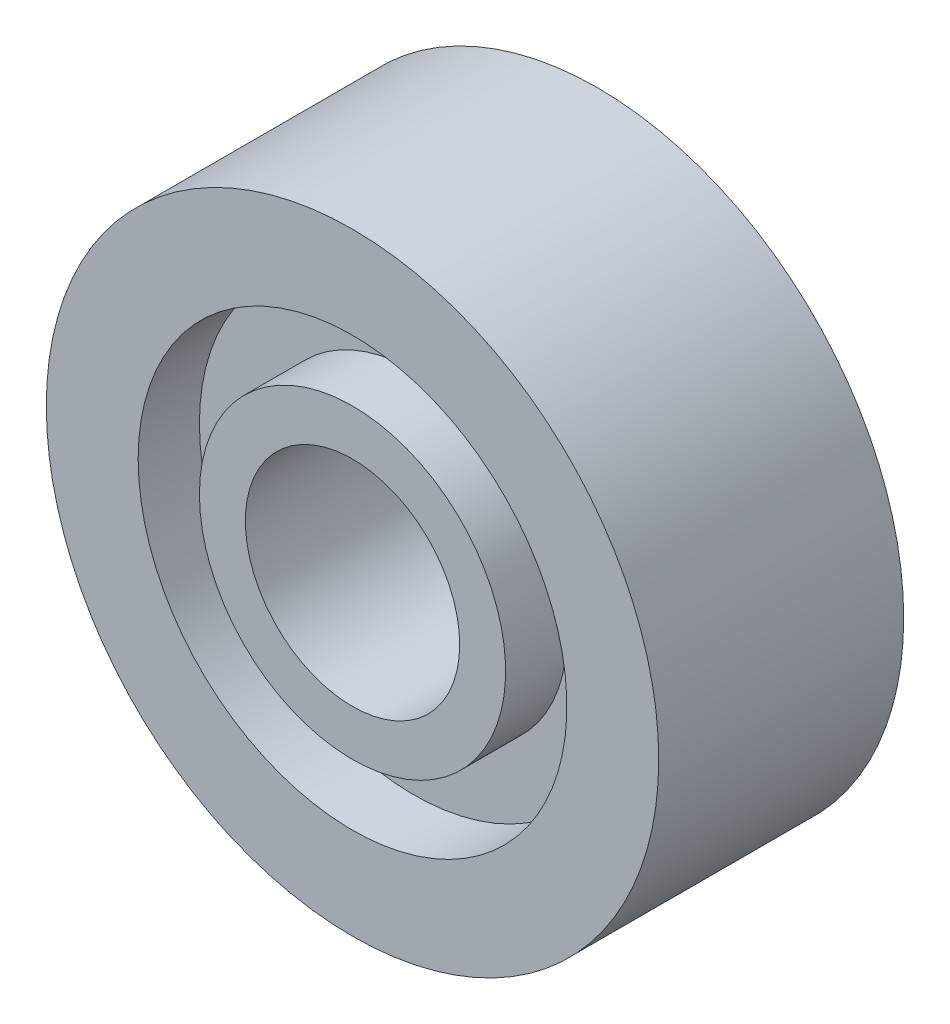
ISO-10303-21;
HEADER;
FILE_DESCRIPTION(('STEP AP214'),'2;1');
FILE_NAME('part.step','',(''),(''),'','','');
FILE_SCHEMA(('AUTOMOTIVE_DESIGN { 1 0 10303 214 1 1 1 1 }'));
ENDSEC;
DATA;
#1=APPLICATION_CONTEXT('core data for automotive mechanical design processes');
#2=APPLICATION_PROTOCOL_DEFINITION('international standard','automotive_design',2000,#1);
#3=PRODUCT_CONTEXT('',#1,'mechanical');
#4=PRODUCT('Part','Part','',(#3));
#5=PRODUCT_RELATED_PRODUCT_CATEGORY('part','',(#4));
#6=PRODUCT_DEFINITION_FORMATION('','',#4);
#7=PRODUCT_DEFINITION_CONTEXT('part definition',#1,'design');
#8=PRODUCT_DEFINITION('design','',#6,#7);
#9=PRODUCT_DEFINITION_SHAPE('','',#8);
#10=(LENGTH_UNIT() NAMED_UNIT(*) SI_UNIT(.MILLI.,.METRE.));
#11=(NAMED_UNIT(*) PLANE_ANGLE_UNIT() SI_UNIT($,.RADIAN.));
#12=(NAMED_UNIT(*) SI_UNIT($,.STERADIAN.) SOLID_ANGLE_UNIT());
#13=UNCERTAINTY_MEASURE_WITH_UNIT(LENGTH_MEASURE(1.E-05),#10,'distance_accuracy_value','');
#14=(GEOMETRIC_REPRESENTATION_CONTEXT(3) GLOBAL_UNCERTAINTY_ASSIGNED_CONTEXT((#13)) GLOBAL_UNIT_ASSIGNED_CONTEXT((#10,
#11,#12)) REPRESENTATION_CONTEXT('',''));
#15=CARTESIAN_POINT('',(0.,0.,0.));
#16=DIRECTION('',(0.,0.,1.));
#17=DIRECTION('',(1.,0.,0.));
#18=AXIS2_PLACEMENT_3D('',#15,#16,#17);
#19=CARTESIAN_POINT('',(0.,0.,4.));
#20=DIRECTION('',(0.,0.,1.));
#21=DIRECTION('',(1.,0.,0.));
#22=AXIS2_PLACEMENT_3D('',#19,#20,#21);
#23=PLANE('',#22);
#24=CARTESIAN_POINT('',(0.,0.,4.));
#25=DIRECTION('',(0.,0.,1.));
#26=DIRECTION('',(1.,0.,0.));
#27=AXIS2_PLACEMENT_3D('',#24,#25,#26);
#28=CIRCLE('',#27,1.75);
#29=CARTESIAN_POINT('',(1.75,0.,4.));
#30=VERTEX_POINT('',#29);
#31=EDGE_CURVE('E43',#30,#30,#28,.T.);
#32=ORIENTED_EDGE('',*,*,#31,.F.);
#33=EDGE_LOOP('',(#32));
#34=FACE_BOUND('',#33,.T.);
#35=CARTESIAN_POINT('',(0.,0.,4.));
#36=DIRECTION('',(0.,0.,-1.));
#37=DIRECTION('',(-1.,0.,0.));
#38=AXIS2_PLACEMENT_3D('',#35,#36,#37);
#39=CIRCLE('',#38,2.5);
#40=CARTESIAN_POINT('',(-2.5,0.,4.));
#41=VERTEX_POINT('',#40);
#42=EDGE_CURVE('E69',#41,#41,#39,.T.);
#43=ORIENTED_EDGE('',*,*,#42,.F.);
#44=EDGE_LOOP('',(#43));
#45=FACE_BOUND('',#44,.T.);
#46=ADVANCED_FACE('F32',(#34,#45),#23,.T.);
#47=CARTESIAN_POINT('',(0.,0.,0.));
#48=DIRECTION('',(0.,0.,1.));
#49=DIRECTION('',(1.,0.,0.));
#50=AXIS2_PLACEMENT_3D('',#47,#48,#49);
#51=PLANE('',#50);
#52=CARTESIAN_POINT('',(0.,0.,0.));
#53=DIRECTION('',(0.,0.,1.));
#54=DIRECTION('',(1.,0.,0.));
#55=AXIS2_PLACEMENT_3D('',#52,#53,#54);
#56=CIRCLE('',#55,1.75);
#57=CARTESIAN_POINT('',(1.75,0.,0.));
#58=VERTEX_POINT('',#57);
#59=EDGE_CURVE('E45',#58,#58,#56,.T.);
#60=ORIENTED_EDGE('',*,*,#59,.T.);
#61=EDGE_LOOP('',(#60));
#62=FACE_BOUND('',#61,.T.);
#63=CARTESIAN_POINT('',(0.,0.,0.));
#64=DIRECTION('',(0.,0.,-1.));
#65=DIRECTION('',(-1.,0.,0.));
#66=AXIS2_PLACEMENT_3D('',#63,#64,#65);
#67=CIRCLE('',#66,2.5);
#68=CARTESIAN_POINT('',(-2.5,0.,0.));
#69=VERTEX_POINT('',#68);
#70=EDGE_CURVE('E57',#69,#69,#67,.T.);
#71=ORIENTED_EDGE('',*,*,#70,.T.);
#72=EDGE_LOOP('',(#71));
#73=FACE_BOUND('',#72,.T.);
#74=ADVANCED_FACE('F85',(#62,#73),#51,.F.);
#75=CARTESIAN_POINT('',(0.,0.,4.));
#76=DIRECTION('',(0.,0.,-1.));
#77=DIRECTION('',(-1.,0.,0.));
#78=AXIS2_PLACEMENT_3D('',#75,#76,#77);
#79=CIRCLE('',#78,3.5);
#80=CARTESIAN_POINT('',(-3.5,0.,4.));
#81=VERTEX_POINT('',#80);
#82=EDGE_CURVE('E63',#81,#81,#79,.T.);
#83=ORIENTED_EDGE('',*,*,#82,.T.);
#84=EDGE_LOOP('',(#83));
#85=FACE_BOUND('',#84,.T.);
#86=CARTESIAN_POINT('',(0.,0.,4.));
#87=DIRECTION('',(0.,0.,1.));
#88=DIRECTION('',(1.,0.,0.));
#89=AXIS2_PLACEMENT_3D('',#86,#87,#88);
#90=CIRCLE('',#89,5.);
#91=CARTESIAN_POINT('',(5.,0.,4.));
#92=VERTEX_POINT('',#91);
#93=EDGE_CURVE('E10',#92,#92,#90,.T.);
#94=ORIENTED_EDGE('',*,*,#93,.T.);
#95=EDGE_LOOP('',(#94));
#96=FACE_BOUND('',#95,.T.);
#97=ADVANCED_FACE('F88',(#85,#96),#23,.T.);
#98=CARTESIAN_POINT('',(0.,0.,0.));
#99=DIRECTION('',(0.,0.,-1.));
#100=DIRECTION('',(-1.,0.,0.));
#101=AXIS2_PLACEMENT_3D('',#98,#99,#100);
#102=CIRCLE('',#101,3.5);
#103=CARTESIAN_POINT('',(-3.5,0.,0.));
#104=VERTEX_POINT('',#103);
#105=EDGE_CURVE('E51',#104,#104,#102,.T.);
#106=ORIENTED_EDGE('',*,*,#105,.F.);
#107=EDGE_LOOP('',(#106));
#108=FACE_BOUND('',#107,.T.);
#109=CARTESIAN_POINT('',(0.,0.,0.));
#110=DIRECTION('',(0.,0.,1.));
#111=DIRECTION('',(1.,0.,0.));
#112=AXIS2_PLACEMENT_3D('',#109,#110,#111);
#113=CIRCLE('',#112,5.);
#114=CARTESIAN_POINT('',(5.,0.,0.));
#115=VERTEX_POINT('',#114);
#116=EDGE_CURVE('E36',#115,#115,#113,.T.);
#117=ORIENTED_EDGE('',*,*,#116,.F.);
#118=EDGE_LOOP('',(#117));
#119=FACE_BOUND('',#118,.T.);
#120=ADVANCED_FACE('F93',(#108,#119),#51,.F.);
#121=CARTESIAN_POINT('',(0.,0.,4.));
#122=DIRECTION('',(0.,0.,-1.));
#123=DIRECTION('',(-1.,0.,0.));
#124=AXIS2_PLACEMENT_3D('',#121,#122,#123);
#125=CYLINDRICAL_SURFACE('',#124,5.);
#126=ORIENTED_EDGE('',*,*,#93,.F.);
#127=EDGE_LOOP('',(#126));
#128=FACE_BOUND('',#127,.T.);
#129=ORIENTED_EDGE('',*,*,#116,.T.);
#130=EDGE_LOOP('',(#129));
#131=FACE_BOUND('',#130,.T.);
#132=ADVANCED_FACE('F34',(#128,#131),#125,.T.);
#133=CARTESIAN_POINT('',(0.,0.,4.));
#134=DIRECTION('',(0.,0.,-1.));
#135=DIRECTION('',(-1.,0.,0.));
#136=AXIS2_PLACEMENT_3D('',#133,#134,#135);
#137=CYLINDRICAL_SURFACE('',#136,1.75);
#138=ORIENTED_EDGE('',*,*,#31,.T.);
#139=EDGE_LOOP('',(#138));
#140=FACE_BOUND('',#139,.T.);
#141=ORIENTED_EDGE('',*,*,#59,.F.);
#142=EDGE_LOOP('',(#141));
#143=FACE_BOUND('',#142,.T.);
#144=ADVANCED_FACE('F123',(#140,#143),#137,.F.);
#145=CARTESIAN_POINT('',(0.,0.,1.));
#146=DIRECTION('',(0.,0.,-1.));
#147=DIRECTION('',(-1.,0.,0.));
#148=AXIS2_PLACEMENT_3D('',#145,#146,#147);
#149=CYLINDRICAL_SURFACE('',#148,3.5);
#150=CARTESIAN_POINT('',(0.,0.,1.));
#151=DIRECTION('',(0.,0.,-1.));
#152=DIRECTION('',(-1.,0.,0.));
#153=AXIS2_PLACEMENT_3D('',#150,#151,#152);
#154=CIRCLE('',#153,3.5);
#155=CARTESIAN_POINT('',(-3.5,0.,1.));
#156=VERTEX_POINT('',#155);
#157=EDGE_CURVE('E48',#156,#156,#154,.T.);
#158=ORIENTED_EDGE('',*,*,#157,.F.);
#159=EDGE_LOOP('',(#158));
#160=FACE_BOUND('',#159,.T.);
#161=ORIENTED_EDGE('',*,*,#105,.T.);
#162=EDGE_LOOP('',(#161));
#163=FACE_BOUND('',#162,.T.);
#164=ADVANCED_FACE('F120',(#160,#163),#149,.F.);
#165=CARTESIAN_POINT('',(0.,0.,1.));
#166=DIRECTION('',(0.,0.,-1.));
#167=DIRECTION('',(-1.,0.,0.));
#168=AXIS2_PLACEMENT_3D('',#165,#166,#167);
#169=PLANE('',#168);
#170=CARTESIAN_POINT('',(0.,0.,1.));
#171=DIRECTION('',(0.,0.,-1.));
#172=DIRECTION('',(-1.,0.,0.));
#173=AXIS2_PLACEMENT_3D('',#170,#171,#172);
#174=CIRCLE('',#173,2.5);
#175=CARTESIAN_POINT('',(-2.5,0.,1.));
#176=VERTEX_POINT('',#175);
#177=EDGE_CURVE('E54',#176,#176,#174,.T.);
#178=ORIENTED_EDGE('',*,*,#177,.F.);
#179=EDGE_LOOP('',(#178));
#180=FACE_BOUND('',#179,.T.);
#181=ORIENTED_EDGE('',*,*,#157,.T.);
#182=EDGE_LOOP('',(#181));
#183=FACE_BOUND('',#182,.T.);
#184=ADVANCED_FACE('F116',(#180,#183),#169,.T.);
#185=CARTESIAN_POINT('',(0.,0.,1.));
#186=DIRECTION('',(0.,0.,-1.));
#187=DIRECTION('',(-1.,0.,0.));
#188=AXIS2_PLACEMENT_3D('',#185,#186,#187);
#189=CYLINDRICAL_SURFACE('',#188,2.5);
#190=ORIENTED_EDGE('',*,*,#177,.T.);
#191=EDGE_LOOP('',(#190));
#192=FACE_BOUND('',#191,.T.);
#193=ORIENTED_EDGE('',*,*,#70,.F.);
#194=EDGE_LOOP('',(#193));
#195=FACE_BOUND('',#194,.T.);
#196=ADVANCED_FACE('F110',(#192,#195),#189,.T.);
#197=CARTESIAN_POINT('',(0.,0.,3.));
#198=DIRECTION('',(0.,0.,1.));
#199=DIRECTION('',(-1.,0.,0.));
#200=AXIS2_PLACEMENT_3D('',#197,#198,#199);
#201=PLANE('',#200);
#202=CARTESIAN_POINT('',(0.,0.,3.));
#203=DIRECTION('',(0.,0.,-1.));
#204=DIRECTION('',(-1.,0.,0.));
#205=AXIS2_PLACEMENT_3D('',#202,#203,#204);
#206=CIRCLE('',#205,3.5);
#207=CARTESIAN_POINT('',(-3.5,0.,3.));
#208=VERTEX_POINT('',#207);
#209=EDGE_CURVE('E60',#208,#208,#206,.T.);
#210=ORIENTED_EDGE('',*,*,#209,.F.);
#211=EDGE_LOOP('',(#210));
#212=FACE_BOUND('',#211,.T.);
#213=CARTESIAN_POINT('',(0.,0.,3.));
#214=DIRECTION('',(0.,0.,-1.));
#215=DIRECTION('',(-1.,0.,0.));
#216=AXIS2_PLACEMENT_3D('',#213,#214,#215);
#217=CIRCLE('',#216,2.5);
#218=CARTESIAN_POINT('',(-2.5,0.,3.));
#219=VERTEX_POINT('',#218);
#220=EDGE_CURVE('E66',#219,#219,#217,.T.);
#221=ORIENTED_EDGE('',*,*,#220,.T.);
#222=EDGE_LOOP('',(#221));
#223=FACE_BOUND('',#222,.T.);
#224=ADVANCED_FACE('F75',(#212,#223),#201,.T.);
#225=CARTESIAN_POINT('',(0.,0.,3.));
#226=DIRECTION('',(0.,0.,1.));
#227=DIRECTION('',(1.,0.,0.));
#228=AXIS2_PLACEMENT_3D('',#225,#226,#227);
#229=CYLINDRICAL_SURFACE('',#228,3.5);
#230=ORIENTED_EDGE('',*,*,#209,.T.);
#231=EDGE_LOOP('',(#230));
#232=FACE_BOUND('',#231,.T.);
#233=ORIENTED_EDGE('',*,*,#82,.F.);
#234=EDGE_LOOP('',(#233));
#235=FACE_BOUND('',#234,.T.);
#236=ADVANCED_FACE('F80',(#232,#235),#229,.F.);
#237=CARTESIAN_POINT('',(0.,0.,3.));
#238=DIRECTION('',(0.,0.,1.));
#239=DIRECTION('',(1.,0.,0.));
#240=AXIS2_PLACEMENT_3D('',#237,#238,#239);
#241=CYLINDRICAL_SURFACE('',#240,2.5);
#242=ORIENTED_EDGE('',*,*,#220,.F.);
#243=EDGE_LOOP('',(#242));
#244=FACE_BOUND('',#243,.T.);
#245=ORIENTED_EDGE('',*,*,#42,.T.);
#246=EDGE_LOOP('',(#245));
#247=FACE_BOUND('',#246,.T.);
#248=ADVANCED_FACE('F77',(#244,#247),#241,.T.);
#249=CLOSED_SHELL('',(#46,#74,#97,#120,#132,#144,#164,#184,#196,#224,#236,#248));
#250=MANIFOLD_SOLID_BREP('B2',#249);
#251=ADVANCED_BREP_SHAPE_REPRESENTATION('',(#18,#250),#14);
#252=SHAPE_DEFINITION_REPRESENTATION(#9,#251);
ENDSEC;
END-ISO-10303-21;
